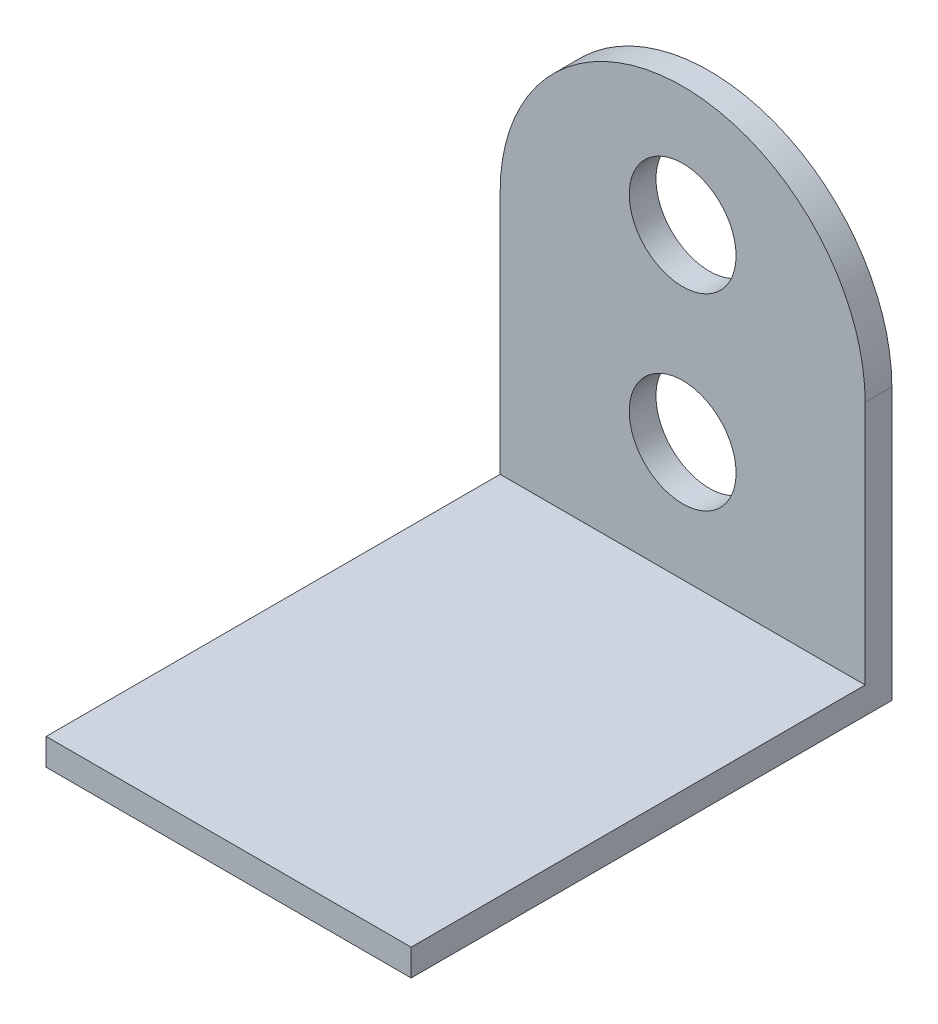
ISO-10303-21;
HEADER;
FILE_DESCRIPTION(('STEP AP214'),'2;1');
FILE_NAME('part.step','',(''),(''),'','','');
FILE_SCHEMA(('AUTOMOTIVE_DESIGN { 1 0 10303 214 1 1 1 1 }'));
ENDSEC;
DATA;
#1=APPLICATION_CONTEXT('core data for automotive mechanical design processes');
#2=APPLICATION_PROTOCOL_DEFINITION('international standard','automotive_design',2000,#1);
#3=PRODUCT_CONTEXT('',#1,'mechanical');
#4=PRODUCT('Part','Part','',(#3));
#5=PRODUCT_RELATED_PRODUCT_CATEGORY('part','',(#4));
#6=PRODUCT_DEFINITION_FORMATION('','',#4);
#7=PRODUCT_DEFINITION_CONTEXT('part definition',#1,'design');
#8=PRODUCT_DEFINITION('design','',#6,#7);
#9=PRODUCT_DEFINITION_SHAPE('','',#8);
#10=(LENGTH_UNIT() NAMED_UNIT(*) SI_UNIT(.MILLI.,.METRE.));
#11=(NAMED_UNIT(*) PLANE_ANGLE_UNIT() SI_UNIT($,.RADIAN.));
#12=(NAMED_UNIT(*) SI_UNIT($,.STERADIAN.) SOLID_ANGLE_UNIT());
#13=UNCERTAINTY_MEASURE_WITH_UNIT(LENGTH_MEASURE(1.E-05),#10,'distance_accuracy_value','');
#14=(GEOMETRIC_REPRESENTATION_CONTEXT(3) GLOBAL_UNCERTAINTY_ASSIGNED_CONTEXT((#13)) GLOBAL_UNIT_ASSIGNED_CONTEXT((#10,
#11,#12)) REPRESENTATION_CONTEXT('',''));
#15=CARTESIAN_POINT('',(0.,0.,0.));
#16=DIRECTION('',(0.,0.,1.));
#17=DIRECTION('',(1.,0.,0.));
#18=AXIS2_PLACEMENT_3D('',#15,#16,#17);
#19=CARTESIAN_POINT('',(-83.7552941176471,3.,-19.9582174688057));
#20=DIRECTION('',(-1.,0.,0.));
#21=DIRECTION('',(0.,0.,1.));
#22=AXIS2_PLACEMENT_3D('',#19,#20,#21);
#23=PLANE('',#22);
#24=DIRECTION('',(0.,0.,-1.));
#25=VECTOR('',#24,1.);
#26=CARTESIAN_POINT('',(-83.7552941176471,30.5,92.8431663771516));
#27=LINE('',#26,#25);
#28=CARTESIAN_POINT('',(-83.7552941176471,30.5,-16.9582174688057));
#29=VERTEX_POINT('',#28);
#30=CARTESIAN_POINT('',(-83.7552941176471,30.5,-19.9582174688057));
#31=VERTEX_POINT('',#30);
#32=EDGE_CURVE('E96',#29,#31,#27,.T.);
#33=ORIENTED_EDGE('',*,*,#32,.F.);
#34=DIRECTION('',(0.,-1.,0.));
#35=VECTOR('',#34,1.);
#36=CARTESIAN_POINT('',(-83.7552941176471,51.,-16.9582174688057));
#37=LINE('',#36,#35);
#38=CARTESIAN_POINT('',(-83.7552941176471,3.,-16.9582174688057));
#39=VERTEX_POINT('',#38);
#40=EDGE_CURVE('E85',#29,#39,#37,.T.);
#41=ORIENTED_EDGE('',*,*,#40,.T.);
#42=DIRECTION('',(0.,0.,-1.));
#43=VECTOR('',#42,1.);
#44=CARTESIAN_POINT('',(-83.7552941176471,3.,-19.9582174688057));
#45=LINE('',#44,#43);
#46=CARTESIAN_POINT('',(-83.7552941176471,3.,34.0417825311943));
#47=VERTEX_POINT('',#46);
#48=EDGE_CURVE('E123',#47,#39,#45,.T.);
#49=ORIENTED_EDGE('',*,*,#48,.F.);
#50=DIRECTION('',(0.,-1.,0.));
#51=VECTOR('',#50,1.);
#52=CARTESIAN_POINT('',(-83.7552941176471,3.,34.0417825311943));
#53=LINE('',#52,#51);
#54=CARTESIAN_POINT('',(-83.7552941176471,0.,34.0417825311943));
#55=VERTEX_POINT('',#54);
#56=EDGE_CURVE('E127',#47,#55,#53,.T.);
#57=ORIENTED_EDGE('',*,*,#56,.T.);
#58=DIRECTION('',(0.,0.,-1.));
#59=VECTOR('',#58,1.);
#60=CARTESIAN_POINT('',(-83.7552941176471,0.,-19.9582174688057));
#61=LINE('',#60,#59);
#62=CARTESIAN_POINT('',(-83.7552941176471,0.,-19.9582174688057));
#63=VERTEX_POINT('',#62);
#64=EDGE_CURVE('E128',#55,#63,#61,.T.);
#65=ORIENTED_EDGE('',*,*,#64,.T.);
#66=DIRECTION('',(0.,-1.,0.));
#67=VECTOR('',#66,1.);
#68=CARTESIAN_POINT('',(-83.7552941176471,3.,-19.9582174688057));
#69=LINE('',#68,#67);
#70=EDGE_CURVE('E11',#31,#63,#69,.T.);
#71=ORIENTED_EDGE('',*,*,#70,.F.);
#72=EDGE_LOOP('',(#33,#41,#49,#57,#65,#71));
#73=FACE_BOUND('',#72,.T.);
#74=ADVANCED_FACE('F32',(#73),#23,.F.);
#75=CARTESIAN_POINT('',(-124.755294117647,3.,-19.9582174688057));
#76=DIRECTION('',(0.,0.,1.));
#77=DIRECTION('',(1.,0.,0.));
#78=AXIS2_PLACEMENT_3D('',#75,#76,#77);
#79=PLANE('',#78);
#80=CARTESIAN_POINT('',(-104.255294117647,16.3788458837075,-19.9582174688057));
#81=DIRECTION('',(0.,0.,1.));
#82=DIRECTION('',(1.,0.,0.));
#83=AXIS2_PLACEMENT_3D('',#80,#81,#82);
#84=CIRCLE('',#83,6.);
#85=CARTESIAN_POINT('',(-98.2552941176471,16.3788458837075,-19.9582174688057));
#86=VERTEX_POINT('',#85);
#87=EDGE_CURVE('E244',#86,#86,#84,.T.);
#88=ORIENTED_EDGE('',*,*,#87,.T.);
#89=EDGE_LOOP('',(#88));
#90=FACE_BOUND('',#89,.T.);
#91=CARTESIAN_POINT('',(-104.255294117647,37.5,-19.9582174688057));
#92=DIRECTION('',(0.,0.,1.));
#93=DIRECTION('',(1.,0.,0.));
#94=AXIS2_PLACEMENT_3D('',#91,#92,#93);
#95=CIRCLE('',#94,6.);
#96=CARTESIAN_POINT('',(-98.2552941176471,37.5,-19.9582174688057));
#97=VERTEX_POINT('',#96);
#98=EDGE_CURVE('E106',#97,#97,#95,.T.);
#99=ORIENTED_EDGE('',*,*,#98,.T.);
#100=EDGE_LOOP('',(#99));
#101=FACE_BOUND('',#100,.T.);
#102=CARTESIAN_POINT('',(-104.255294117647,30.5,-19.9582174688057));
#103=DIRECTION('',(0.,0.,1.));
#104=DIRECTION('',(1.,0.,0.));
#105=AXIS2_PLACEMENT_3D('',#102,#103,#104);
#106=CIRCLE('',#105,20.5);
#107=CARTESIAN_POINT('',(-124.755294117647,30.5,-19.9582174688057));
#108=VERTEX_POINT('',#107);
#109=EDGE_CURVE('E48',#31,#108,#106,.T.);
#110=ORIENTED_EDGE('',*,*,#109,.F.);
#111=ORIENTED_EDGE('',*,*,#70,.T.);
#112=DIRECTION('',(-1.,0.,0.));
#113=VECTOR('',#112,1.);
#114=CARTESIAN_POINT('',(-124.755294117647,0.,-19.9582174688057));
#115=LINE('',#114,#113);
#116=CARTESIAN_POINT('',(-124.755294117647,0.,-19.9582174688057));
#117=VERTEX_POINT('',#116);
#118=EDGE_CURVE('E130',#63,#117,#115,.T.);
#119=ORIENTED_EDGE('',*,*,#118,.T.);
#120=DIRECTION('',(0.,-1.,0.));
#121=VECTOR('',#120,1.);
#122=CARTESIAN_POINT('',(-124.755294117647,3.,-19.9582174688057));
#123=LINE('',#122,#121);
#124=EDGE_CURVE('E41',#108,#117,#123,.T.);
#125=ORIENTED_EDGE('',*,*,#124,.F.);
#126=EDGE_LOOP('',(#110,#111,#119,#125));
#127=FACE_BOUND('',#126,.T.);
#128=ADVANCED_FACE('F147',(#90,#101,#127),#79,.F.);
#129=CARTESIAN_POINT('',(-83.7552941176471,51.,-16.9582174688057));
#130=DIRECTION('',(0.,0.,-1.));
#131=DIRECTION('',(-1.,0.,0.));
#132=AXIS2_PLACEMENT_3D('',#129,#130,#131);
#133=PLANE('',#132);
#134=CARTESIAN_POINT('',(-104.255294117647,16.3788458837075,-16.9582174688057));
#135=DIRECTION('',(0.,0.,1.));
#136=DIRECTION('',(1.,0.,0.));
#137=AXIS2_PLACEMENT_3D('',#134,#135,#136);
#138=CIRCLE('',#137,6.);
#139=CARTESIAN_POINT('',(-98.2552941176471,16.3788458837075,-16.9582174688057));
#140=VERTEX_POINT('',#139);
#141=EDGE_CURVE('E247',#140,#140,#138,.T.);
#142=ORIENTED_EDGE('',*,*,#141,.F.);
#143=EDGE_LOOP('',(#142));
#144=FACE_BOUND('',#143,.T.);
#145=CARTESIAN_POINT('',(-104.255294117647,37.5,-16.9582174688057));
#146=DIRECTION('',(0.,0.,1.));
#147=DIRECTION('',(1.,0.,0.));
#148=AXIS2_PLACEMENT_3D('',#145,#146,#147);
#149=CIRCLE('',#148,6.);
#150=CARTESIAN_POINT('',(-98.2552941176471,37.5,-16.9582174688057));
#151=VERTEX_POINT('',#150);
#152=EDGE_CURVE('E102',#151,#151,#149,.T.);
#153=ORIENTED_EDGE('',*,*,#152,.F.);
#154=EDGE_LOOP('',(#153));
#155=FACE_BOUND('',#154,.T.);
#156=CARTESIAN_POINT('',(-104.255294117647,30.5,-16.9582174688057));
#157=DIRECTION('',(0.,0.,-1.));
#158=DIRECTION('',(-1.,0.,0.));
#159=AXIS2_PLACEMENT_3D('',#156,#157,#158);
#160=CIRCLE('',#159,20.5);
#161=CARTESIAN_POINT('',(-124.755294117647,30.5,-16.9582174688057));
#162=VERTEX_POINT('',#161);
#163=EDGE_CURVE('E89',#162,#29,#160,.T.);
#164=ORIENTED_EDGE('',*,*,#163,.F.);
#165=DIRECTION('',(0.,-1.,0.));
#166=VECTOR('',#165,1.);
#167=CARTESIAN_POINT('',(-124.755294117647,51.,-16.9582174688057));
#168=LINE('',#167,#166);
#169=CARTESIAN_POINT('',(-124.755294117647,3.,-16.9582174688057));
#170=VERTEX_POINT('',#169);
#171=EDGE_CURVE('E35',#162,#170,#168,.T.);
#172=ORIENTED_EDGE('',*,*,#171,.T.);
#173=DIRECTION('',(1.,0.,0.));
#174=VECTOR('',#173,1.);
#175=CARTESIAN_POINT('',(-83.7552941176471,3.,-16.9582174688057));
#176=LINE('',#175,#174);
#177=EDGE_CURVE('E92',#170,#39,#176,.T.);
#178=ORIENTED_EDGE('',*,*,#177,.T.);
#179=ORIENTED_EDGE('',*,*,#40,.F.);
#180=EDGE_LOOP('',(#164,#172,#178,#179));
#181=FACE_BOUND('',#180,.T.);
#182=ADVANCED_FACE('F87',(#144,#155,#181),#133,.F.);
#183=CARTESIAN_POINT('',(-124.755294117647,3.,-19.9582174688057));
#184=DIRECTION('',(1.,0.,0.));
#185=DIRECTION('',(0.,0.,-1.));
#186=AXIS2_PLACEMENT_3D('',#183,#184,#185);
#187=PLANE('',#186);
#188=ORIENTED_EDGE('',*,*,#171,.F.);
#189=DIRECTION('',(0.,0.,-1.));
#190=VECTOR('',#189,1.);
#191=CARTESIAN_POINT('',(-124.755294117647,30.5,92.8431663771516));
#192=LINE('',#191,#190);
#193=EDGE_CURVE('E98',#162,#108,#192,.T.);
#194=ORIENTED_EDGE('',*,*,#193,.T.);
#195=ORIENTED_EDGE('',*,*,#124,.T.);
#196=DIRECTION('',(0.,0.,1.));
#197=VECTOR('',#196,1.);
#198=CARTESIAN_POINT('',(-124.755294117647,0.,-19.9582174688057));
#199=LINE('',#198,#197);
#200=CARTESIAN_POINT('',(-124.755294117647,0.,34.0417825311943));
#201=VERTEX_POINT('',#200);
#202=EDGE_CURVE('E133',#117,#201,#199,.T.);
#203=ORIENTED_EDGE('',*,*,#202,.T.);
#204=DIRECTION('',(0.,-1.,0.));
#205=VECTOR('',#204,1.);
#206=CARTESIAN_POINT('',(-124.755294117647,3.,34.0417825311943));
#207=LINE('',#206,#205);
#208=CARTESIAN_POINT('',(-124.755294117647,3.,34.0417825311943));
#209=VERTEX_POINT('',#208);
#210=EDGE_CURVE('E139',#209,#201,#207,.T.);
#211=ORIENTED_EDGE('',*,*,#210,.F.);
#212=DIRECTION('',(0.,0.,1.));
#213=VECTOR('',#212,1.);
#214=CARTESIAN_POINT('',(-124.755294117647,3.,-19.9582174688057));
#215=LINE('',#214,#213);
#216=EDGE_CURVE('E118',#170,#209,#215,.T.);
#217=ORIENTED_EDGE('',*,*,#216,.F.);
#218=EDGE_LOOP('',(#188,#194,#195,#203,#211,#217));
#219=FACE_BOUND('',#218,.T.);
#220=ADVANCED_FACE('F143',(#219),#187,.F.);
#221=CARTESIAN_POINT('',(-124.755294117647,3.,34.0417825311943));
#222=DIRECTION('',(0.,0.,-1.));
#223=DIRECTION('',(-1.,0.,0.));
#224=AXIS2_PLACEMENT_3D('',#221,#222,#223);
#225=PLANE('',#224);
#226=DIRECTION('',(1.,0.,0.));
#227=VECTOR('',#226,1.);
#228=CARTESIAN_POINT('',(-124.755294117647,0.,34.0417825311943));
#229=LINE('',#228,#227);
#230=EDGE_CURVE('E135',#201,#55,#229,.T.);
#231=ORIENTED_EDGE('',*,*,#230,.T.);
#232=ORIENTED_EDGE('',*,*,#56,.F.);
#233=DIRECTION('',(1.,0.,0.));
#234=VECTOR('',#233,1.);
#235=CARTESIAN_POINT('',(-124.755294117647,3.,34.0417825311943));
#236=LINE('',#235,#234);
#237=EDGE_CURVE('E122',#209,#47,#236,.T.);
#238=ORIENTED_EDGE('',*,*,#237,.F.);
#239=ORIENTED_EDGE('',*,*,#210,.T.);
#240=EDGE_LOOP('',(#231,#232,#238,#239));
#241=FACE_BOUND('',#240,.T.);
#242=ADVANCED_FACE('F154',(#241),#225,.F.);
#243=CARTESIAN_POINT('',(0.,3.,0.));
#244=DIRECTION('',(0.,1.,0.));
#245=DIRECTION('',(0.,0.,1.));
#246=AXIS2_PLACEMENT_3D('',#243,#244,#245);
#247=PLANE('',#246);
#248=ORIENTED_EDGE('',*,*,#177,.F.);
#249=ORIENTED_EDGE('',*,*,#216,.T.);
#250=ORIENTED_EDGE('',*,*,#237,.T.);
#251=ORIENTED_EDGE('',*,*,#48,.T.);
#252=EDGE_LOOP('',(#248,#249,#250,#251));
#253=FACE_BOUND('',#252,.T.);
#254=ADVANCED_FACE('F157',(#253),#247,.T.);
#255=CARTESIAN_POINT('',(0.,0.,0.));
#256=DIRECTION('',(0.,1.,0.));
#257=DIRECTION('',(0.,0.,1.));
#258=AXIS2_PLACEMENT_3D('',#255,#256,#257);
#259=PLANE('',#258);
#260=ORIENTED_EDGE('',*,*,#64,.F.);
#261=ORIENTED_EDGE('',*,*,#230,.F.);
#262=ORIENTED_EDGE('',*,*,#202,.F.);
#263=ORIENTED_EDGE('',*,*,#118,.F.);
#264=EDGE_LOOP('',(#260,#261,#262,#263));
#265=FACE_BOUND('',#264,.T.);
#266=ADVANCED_FACE('F151',(#265),#259,.F.);
#267=CARTESIAN_POINT('',(-104.255294117647,37.5,-19.9582174688057));
#268=DIRECTION('',(0.,0.,1.));
#269=DIRECTION('',(1.,0.,0.));
#270=AXIS2_PLACEMENT_3D('',#267,#268,#269);
#271=CYLINDRICAL_SURFACE('',#270,6.);
#272=ORIENTED_EDGE('',*,*,#98,.F.);
#273=EDGE_LOOP('',(#272));
#274=FACE_BOUND('',#273,.T.);
#275=ORIENTED_EDGE('',*,*,#152,.T.);
#276=EDGE_LOOP('',(#275));
#277=FACE_BOUND('',#276,.T.);
#278=ADVANCED_FACE('F165',(#274,#277),#271,.F.);
#279=CARTESIAN_POINT('',(-104.255294117647,30.5,92.8431663771516));
#280=DIRECTION('',(0.,0.,-1.));
#281=DIRECTION('',(-1.,0.,0.));
#282=AXIS2_PLACEMENT_3D('',#279,#280,#281);
#283=CYLINDRICAL_SURFACE('',#282,20.5);
#284=ORIENTED_EDGE('',*,*,#32,.T.);
#285=ORIENTED_EDGE('',*,*,#109,.T.);
#286=ORIENTED_EDGE('',*,*,#193,.F.);
#287=ORIENTED_EDGE('',*,*,#163,.T.);
#288=EDGE_LOOP('',(#284,#285,#286,#287));
#289=FACE_BOUND('',#288,.T.);
#290=ADVANCED_FACE('F100',(#289),#283,.T.);
#291=CARTESIAN_POINT('',(-104.255294117647,16.3788458837075,-19.9582174688057));
#292=DIRECTION('',(0.,0.,1.));
#293=DIRECTION('',(1.,0.,0.));
#294=AXIS2_PLACEMENT_3D('',#291,#292,#293);
#295=CYLINDRICAL_SURFACE('',#294,6.);
#296=ORIENTED_EDGE('',*,*,#87,.F.);
#297=EDGE_LOOP('',(#296));
#298=FACE_BOUND('',#297,.T.);
#299=ORIENTED_EDGE('',*,*,#141,.T.);
#300=EDGE_LOOP('',(#299));
#301=FACE_BOUND('',#300,.T.);
#302=ADVANCED_FACE('F229',(#298,#301),#295,.F.);
#303=CLOSED_SHELL('',(#74,#128,#182,#220,#242,#254,#266,#278,#290,#302));
#304=MANIFOLD_SOLID_BREP('B2',#303);
#305=ADVANCED_BREP_SHAPE_REPRESENTATION('',(#18,#304),#14);
#306=SHAPE_DEFINITION_REPRESENTATION(#9,#305);
ENDSEC;
END-ISO-10303-21;
